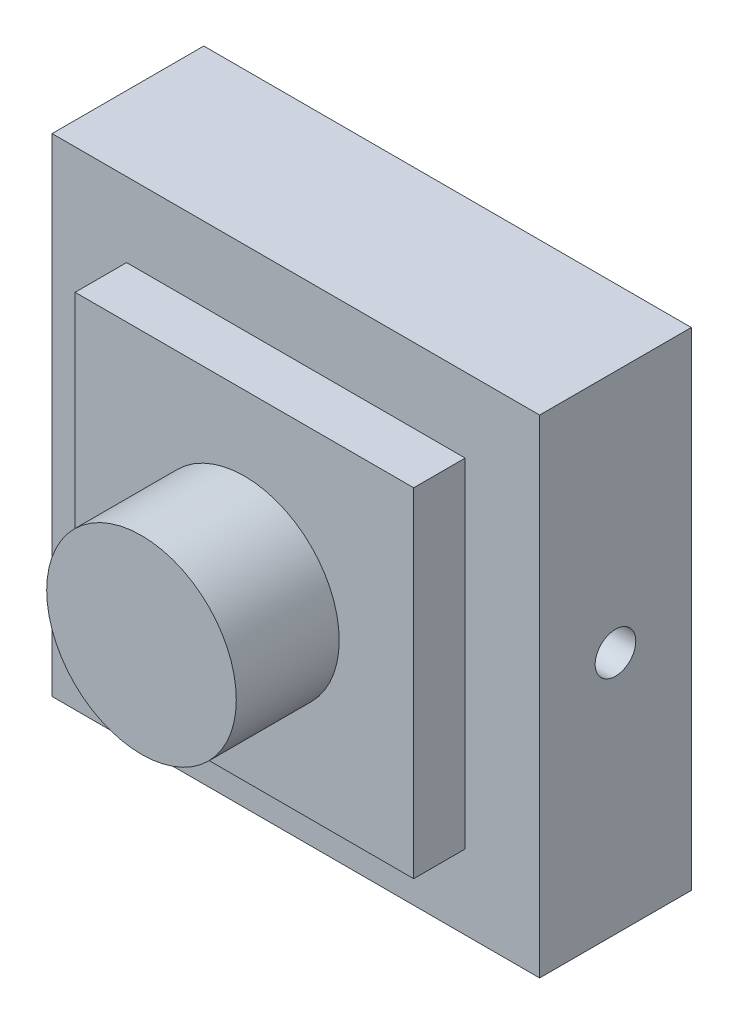
ISO-10303-21;
HEADER;
FILE_DESCRIPTION(('STEP AP214'),'2;1');
FILE_NAME('part.step','',(''),(''),'','','');
FILE_SCHEMA(('AUTOMOTIVE_DESIGN { 1 0 10303 214 1 1 1 1 }'));
ENDSEC;
DATA;
#1=APPLICATION_CONTEXT('core data for automotive mechanical design processes');
#2=APPLICATION_PROTOCOL_DEFINITION('international standard','automotive_design',2000,#1);
#3=PRODUCT_CONTEXT('',#1,'mechanical');
#4=PRODUCT('Part','Part','',(#3));
#5=PRODUCT_RELATED_PRODUCT_CATEGORY('part','',(#4));
#6=PRODUCT_DEFINITION_FORMATION('','',#4);
#7=PRODUCT_DEFINITION_CONTEXT('part definition',#1,'design');
#8=PRODUCT_DEFINITION('design','',#6,#7);
#9=PRODUCT_DEFINITION_SHAPE('','',#8);
#10=(LENGTH_UNIT() NAMED_UNIT(*) SI_UNIT(.MILLI.,.METRE.));
#11=(NAMED_UNIT(*) PLANE_ANGLE_UNIT() SI_UNIT($,.RADIAN.));
#12=(NAMED_UNIT(*) SI_UNIT($,.STERADIAN.) SOLID_ANGLE_UNIT());
#13=UNCERTAINTY_MEASURE_WITH_UNIT(LENGTH_MEASURE(1.E-05),#10,'distance_accuracy_value','');
#14=(GEOMETRIC_REPRESENTATION_CONTEXT(3) GLOBAL_UNCERTAINTY_ASSIGNED_CONTEXT((#13)) GLOBAL_UNIT_ASSIGNED_CONTEXT((#10,
#11,#12)) REPRESENTATION_CONTEXT('',''));
#15=CARTESIAN_POINT('',(0.,0.,0.));
#16=DIRECTION('',(0.,0.,1.));
#17=DIRECTION('',(1.,0.,0.));
#18=AXIS2_PLACEMENT_3D('',#15,#16,#17);
#19=CARTESIAN_POINT('',(0.,0.,11.2));
#20=DIRECTION('',(0.,0.,1.));
#21=DIRECTION('',(1.,0.,0.));
#22=AXIS2_PLACEMENT_3D('',#19,#20,#21);
#23=PLANE('',#22);
#24=DIRECTION('',(0.,-1.,0.));
#25=VECTOR('',#24,1.);
#26=CARTESIAN_POINT('',(-18.,-18.,11.2));
#27=LINE('',#26,#25);
#28=CARTESIAN_POINT('',(-18.,18.,11.2));
#29=VERTEX_POINT('',#28);
#30=CARTESIAN_POINT('',(-18.,-18.,11.2));
#31=VERTEX_POINT('',#30);
#32=EDGE_CURVE('E178',#29,#31,#27,.T.);
#33=ORIENTED_EDGE('',*,*,#32,.T.);
#34=DIRECTION('',(1.,0.,0.));
#35=VECTOR('',#34,1.);
#36=CARTESIAN_POINT('',(18.,-18.,11.2));
#37=LINE('',#36,#35);
#38=CARTESIAN_POINT('',(18.,-18.,11.2));
#39=VERTEX_POINT('',#38);
#40=EDGE_CURVE('E88',#31,#39,#37,.T.);
#41=ORIENTED_EDGE('',*,*,#40,.T.);
#42=DIRECTION('',(0.,1.,0.));
#43=VECTOR('',#42,1.);
#44=CARTESIAN_POINT('',(18.,-18.,11.2));
#45=LINE('',#44,#43);
#46=CARTESIAN_POINT('',(18.,18.,11.2));
#47=VERTEX_POINT('',#46);
#48=EDGE_CURVE('E181',#39,#47,#45,.T.);
#49=ORIENTED_EDGE('',*,*,#48,.T.);
#50=DIRECTION('',(-1.,0.,0.));
#51=VECTOR('',#50,1.);
#52=CARTESIAN_POINT('',(18.,18.,11.2));
#53=LINE('',#52,#51);
#54=EDGE_CURVE('E60',#47,#29,#53,.T.);
#55=ORIENTED_EDGE('',*,*,#54,.T.);
#56=EDGE_LOOP('',(#33,#41,#49,#55));
#57=FACE_BOUND('',#56,.T.);
#58=DIRECTION('',(1.,0.,0.));
#59=VECTOR('',#58,1.);
#60=CARTESIAN_POINT('',(12.5,-12.5,11.2));
#61=LINE('',#60,#59);
#62=CARTESIAN_POINT('',(-12.5,-12.5,11.2));
#63=VERTEX_POINT('',#62);
#64=CARTESIAN_POINT('',(12.5,-12.5,11.2));
#65=VERTEX_POINT('',#64);
#66=EDGE_CURVE('E164',#63,#65,#61,.T.);
#67=ORIENTED_EDGE('',*,*,#66,.F.);
#68=DIRECTION('',(0.,-1.,0.));
#69=VECTOR('',#68,1.);
#70=CARTESIAN_POINT('',(-12.5,-12.5,11.2));
#71=LINE('',#70,#69);
#72=CARTESIAN_POINT('',(-12.5,12.5,11.2));
#73=VERTEX_POINT('',#72);
#74=EDGE_CURVE('E148',#73,#63,#71,.T.);
#75=ORIENTED_EDGE('',*,*,#74,.F.);
#76=DIRECTION('',(-1.,0.,0.));
#77=VECTOR('',#76,1.);
#78=CARTESIAN_POINT('',(12.5,12.5,11.2));
#79=LINE('',#78,#77);
#80=CARTESIAN_POINT('',(12.5,12.5,11.2));
#81=VERTEX_POINT('',#80);
#82=EDGE_CURVE('E155',#81,#73,#79,.T.);
#83=ORIENTED_EDGE('',*,*,#82,.F.);
#84=DIRECTION('',(0.,1.,0.));
#85=VECTOR('',#84,1.);
#86=CARTESIAN_POINT('',(12.5,-12.5,11.2));
#87=LINE('',#86,#85);
#88=EDGE_CURVE('E166',#65,#81,#87,.T.);
#89=ORIENTED_EDGE('',*,*,#88,.F.);
#90=EDGE_LOOP('',(#67,#75,#83,#89));
#91=FACE_BOUND('',#90,.T.);
#92=ADVANCED_FACE('F36',(#57,#91),#23,.T.);
#93=CARTESIAN_POINT('',(-18.,-18.,11.2));
#94=DIRECTION('',(1.,0.,0.));
#95=DIRECTION('',(0.,0.,-1.));
#96=AXIS2_PLACEMENT_3D('',#93,#94,#95);
#97=PLANE('',#96);
#98=CARTESIAN_POINT('',(-18.,0.,5.6));
#99=DIRECTION('',(-1.,0.,0.));
#100=DIRECTION('',(0.,0.,1.));
#101=AXIS2_PLACEMENT_3D('',#98,#99,#100);
#102=CIRCLE('',#101,1.49999999999999);
#103=CARTESIAN_POINT('',(-18.,0.,7.09999999999999));
#104=VERTEX_POINT('',#103);
#105=EDGE_CURVE('E125',#104,#104,#102,.T.);
#106=ORIENTED_EDGE('',*,*,#105,.F.);
#107=EDGE_LOOP('',(#106));
#108=FACE_BOUND('',#107,.T.);
#109=DIRECTION('',(0.,-1.,0.));
#110=VECTOR('',#109,1.);
#111=CARTESIAN_POINT('',(-18.,-18.,0.));
#112=LINE('',#111,#110);
#113=CARTESIAN_POINT('',(-18.,18.,0.));
#114=VERTEX_POINT('',#113);
#115=CARTESIAN_POINT('',(-18.,-18.,0.));
#116=VERTEX_POINT('',#115);
#117=EDGE_CURVE('E177',#114,#116,#112,.T.);
#118=ORIENTED_EDGE('',*,*,#117,.T.);
#119=DIRECTION('',(0.,0.,-1.));
#120=VECTOR('',#119,1.);
#121=CARTESIAN_POINT('',(-18.,-18.,11.2));
#122=LINE('',#121,#120);
#123=EDGE_CURVE('E11',#31,#116,#122,.T.);
#124=ORIENTED_EDGE('',*,*,#123,.F.);
#125=ORIENTED_EDGE('',*,*,#32,.F.);
#126=DIRECTION('',(0.,0.,-1.));
#127=VECTOR('',#126,1.);
#128=CARTESIAN_POINT('',(-18.,18.,11.2));
#129=LINE('',#128,#127);
#130=EDGE_CURVE('E184',#29,#114,#129,.T.);
#131=ORIENTED_EDGE('',*,*,#130,.T.);
#132=EDGE_LOOP('',(#118,#124,#125,#131));
#133=FACE_BOUND('',#132,.T.);
#134=ADVANCED_FACE('F38',(#108,#133),#97,.F.);
#135=CARTESIAN_POINT('',(18.,-18.,11.2));
#136=DIRECTION('',(0.,1.,0.));
#137=DIRECTION('',(-1.,0.,0.));
#138=AXIS2_PLACEMENT_3D('',#135,#136,#137);
#139=PLANE('',#138);
#140=DIRECTION('',(1.,0.,0.));
#141=VECTOR('',#140,1.);
#142=CARTESIAN_POINT('',(18.,-18.,0.));
#143=LINE('',#142,#141);
#144=CARTESIAN_POINT('',(18.,-18.,0.));
#145=VERTEX_POINT('',#144);
#146=EDGE_CURVE('E187',#116,#145,#143,.T.);
#147=ORIENTED_EDGE('',*,*,#146,.T.);
#148=DIRECTION('',(0.,0.,-1.));
#149=VECTOR('',#148,1.);
#150=CARTESIAN_POINT('',(18.,-18.,11.2));
#151=LINE('',#150,#149);
#152=EDGE_CURVE('E44',#39,#145,#151,.T.);
#153=ORIENTED_EDGE('',*,*,#152,.F.);
#154=ORIENTED_EDGE('',*,*,#40,.F.);
#155=ORIENTED_EDGE('',*,*,#123,.T.);
#156=EDGE_LOOP('',(#147,#153,#154,#155));
#157=FACE_BOUND('',#156,.T.);
#158=ADVANCED_FACE('F215',(#157),#139,.F.);
#159=CARTESIAN_POINT('',(18.,-18.,11.2));
#160=DIRECTION('',(-1.,0.,0.));
#161=DIRECTION('',(0.,0.,1.));
#162=AXIS2_PLACEMENT_3D('',#159,#160,#161);
#163=PLANE('',#162);
#164=CARTESIAN_POINT('',(18.,0.,5.6));
#165=DIRECTION('',(1.,0.,0.));
#166=DIRECTION('',(0.,0.,-1.));
#167=AXIS2_PLACEMENT_3D('',#164,#165,#166);
#168=CIRCLE('',#167,1.49999999999999);
#169=CARTESIAN_POINT('',(18.,0.,4.10000000000001));
#170=VERTEX_POINT('',#169);
#171=EDGE_CURVE('E283',#170,#170,#168,.T.);
#172=ORIENTED_EDGE('',*,*,#171,.F.);
#173=EDGE_LOOP('',(#172));
#174=FACE_BOUND('',#173,.T.);
#175=DIRECTION('',(0.,1.,0.));
#176=VECTOR('',#175,1.);
#177=CARTESIAN_POINT('',(18.,-18.,0.));
#178=LINE('',#177,#176);
#179=CARTESIAN_POINT('',(18.,18.,0.));
#180=VERTEX_POINT('',#179);
#181=EDGE_CURVE('E189',#145,#180,#178,.T.);
#182=ORIENTED_EDGE('',*,*,#181,.T.);
#183=DIRECTION('',(0.,0.,-1.));
#184=VECTOR('',#183,1.);
#185=CARTESIAN_POINT('',(18.,18.,11.2));
#186=LINE('',#185,#184);
#187=EDGE_CURVE('E193',#47,#180,#186,.T.);
#188=ORIENTED_EDGE('',*,*,#187,.F.);
#189=ORIENTED_EDGE('',*,*,#48,.F.);
#190=ORIENTED_EDGE('',*,*,#152,.T.);
#191=EDGE_LOOP('',(#182,#188,#189,#190));
#192=FACE_BOUND('',#191,.T.);
#193=ADVANCED_FACE('F198',(#174,#192),#163,.F.);
#194=CARTESIAN_POINT('',(18.,18.,11.2));
#195=DIRECTION('',(0.,-1.,0.));
#196=DIRECTION('',(1.,0.,0.));
#197=AXIS2_PLACEMENT_3D('',#194,#195,#196);
#198=PLANE('',#197);
#199=DIRECTION('',(-1.,0.,0.));
#200=VECTOR('',#199,1.);
#201=CARTESIAN_POINT('',(18.,18.,0.));
#202=LINE('',#201,#200);
#203=EDGE_CURVE('E81',#180,#114,#202,.T.);
#204=ORIENTED_EDGE('',*,*,#203,.T.);
#205=ORIENTED_EDGE('',*,*,#130,.F.);
#206=ORIENTED_EDGE('',*,*,#54,.F.);
#207=ORIENTED_EDGE('',*,*,#187,.T.);
#208=EDGE_LOOP('',(#204,#205,#206,#207));
#209=FACE_BOUND('',#208,.T.);
#210=ADVANCED_FACE('F206',(#209),#198,.F.);
#211=CARTESIAN_POINT('',(0.,0.,0.));
#212=DIRECTION('',(0.,0.,1.));
#213=DIRECTION('',(1.,0.,0.));
#214=AXIS2_PLACEMENT_3D('',#211,#212,#213);
#215=PLANE('',#214);
#216=ORIENTED_EDGE('',*,*,#117,.F.);
#217=ORIENTED_EDGE('',*,*,#203,.F.);
#218=ORIENTED_EDGE('',*,*,#181,.F.);
#219=ORIENTED_EDGE('',*,*,#146,.F.);
#220=EDGE_LOOP('',(#216,#217,#218,#219));
#221=FACE_BOUND('',#220,.T.);
#222=ADVANCED_FACE('F202',(#221),#215,.F.);
#223=CARTESIAN_POINT('',(-12.5,-12.5,15.));
#224=DIRECTION('',(1.,0.,0.));
#225=DIRECTION('',(0.,0.,-1.));
#226=AXIS2_PLACEMENT_3D('',#223,#224,#225);
#227=PLANE('',#226);
#228=ORIENTED_EDGE('',*,*,#74,.T.);
#229=DIRECTION('',(0.,0.,-1.));
#230=VECTOR('',#229,1.);
#231=CARTESIAN_POINT('',(-12.5,-12.5,15.));
#232=LINE('',#231,#230);
#233=CARTESIAN_POINT('',(-12.5,-12.5,15.));
#234=VERTEX_POINT('',#233);
#235=EDGE_CURVE('E175',#234,#63,#232,.T.);
#236=ORIENTED_EDGE('',*,*,#235,.F.);
#237=DIRECTION('',(0.,-1.,0.));
#238=VECTOR('',#237,1.);
#239=CARTESIAN_POINT('',(-12.5,-12.5,15.));
#240=LINE('',#239,#238);
#241=CARTESIAN_POINT('',(-12.5,12.5,15.));
#242=VERTEX_POINT('',#241);
#243=EDGE_CURVE('E151',#242,#234,#240,.T.);
#244=ORIENTED_EDGE('',*,*,#243,.F.);
#245=DIRECTION('',(0.,0.,-1.));
#246=VECTOR('',#245,1.);
#247=CARTESIAN_POINT('',(-12.5,12.5,15.));
#248=LINE('',#247,#246);
#249=EDGE_CURVE('E161',#242,#73,#248,.T.);
#250=ORIENTED_EDGE('',*,*,#249,.T.);
#251=EDGE_LOOP('',(#228,#236,#244,#250));
#252=FACE_BOUND('',#251,.T.);
#253=ADVANCED_FACE('F213',(#252),#227,.F.);
#254=CARTESIAN_POINT('',(12.5,-12.5,15.));
#255=DIRECTION('',(0.,1.,0.));
#256=DIRECTION('',(-1.,0.,0.));
#257=AXIS2_PLACEMENT_3D('',#254,#255,#256);
#258=PLANE('',#257);
#259=ORIENTED_EDGE('',*,*,#66,.T.);
#260=DIRECTION('',(0.,0.,-1.));
#261=VECTOR('',#260,1.);
#262=CARTESIAN_POINT('',(12.5,-12.5,15.));
#263=LINE('',#262,#261);
#264=CARTESIAN_POINT('',(12.5,-12.5,15.));
#265=VERTEX_POINT('',#264);
#266=EDGE_CURVE('E172',#265,#65,#263,.T.);
#267=ORIENTED_EDGE('',*,*,#266,.F.);
#268=DIRECTION('',(1.,0.,0.));
#269=VECTOR('',#268,1.);
#270=CARTESIAN_POINT('',(12.5,-12.5,15.));
#271=LINE('',#270,#269);
#272=EDGE_CURVE('E154',#234,#265,#271,.T.);
#273=ORIENTED_EDGE('',*,*,#272,.F.);
#274=ORIENTED_EDGE('',*,*,#235,.T.);
#275=EDGE_LOOP('',(#259,#267,#273,#274));
#276=FACE_BOUND('',#275,.T.);
#277=ADVANCED_FACE('F228',(#276),#258,.F.);
#278=CARTESIAN_POINT('',(12.5,-12.5,15.));
#279=DIRECTION('',(-1.,0.,0.));
#280=DIRECTION('',(0.,0.,1.));
#281=AXIS2_PLACEMENT_3D('',#278,#279,#280);
#282=PLANE('',#281);
#283=ORIENTED_EDGE('',*,*,#88,.T.);
#284=DIRECTION('',(0.,0.,-1.));
#285=VECTOR('',#284,1.);
#286=CARTESIAN_POINT('',(12.5,12.5,15.));
#287=LINE('',#286,#285);
#288=CARTESIAN_POINT('',(12.5,12.5,15.));
#289=VERTEX_POINT('',#288);
#290=EDGE_CURVE('E51',#289,#81,#287,.T.);
#291=ORIENTED_EDGE('',*,*,#290,.F.);
#292=DIRECTION('',(0.,1.,0.));
#293=VECTOR('',#292,1.);
#294=CARTESIAN_POINT('',(12.5,-12.5,15.));
#295=LINE('',#294,#293);
#296=EDGE_CURVE('E157',#265,#289,#295,.T.);
#297=ORIENTED_EDGE('',*,*,#296,.F.);
#298=ORIENTED_EDGE('',*,*,#266,.T.);
#299=EDGE_LOOP('',(#283,#291,#297,#298));
#300=FACE_BOUND('',#299,.T.);
#301=ADVANCED_FACE('F232',(#300),#282,.F.);
#302=CARTESIAN_POINT('',(12.5,12.5,15.));
#303=DIRECTION('',(0.,-1.,0.));
#304=DIRECTION('',(1.,0.,0.));
#305=AXIS2_PLACEMENT_3D('',#302,#303,#304);
#306=PLANE('',#305);
#307=ORIENTED_EDGE('',*,*,#82,.T.);
#308=ORIENTED_EDGE('',*,*,#249,.F.);
#309=DIRECTION('',(-1.,0.,0.));
#310=VECTOR('',#309,1.);
#311=CARTESIAN_POINT('',(12.5,12.5,15.));
#312=LINE('',#311,#310);
#313=EDGE_CURVE('E159',#289,#242,#312,.T.);
#314=ORIENTED_EDGE('',*,*,#313,.F.);
#315=ORIENTED_EDGE('',*,*,#290,.T.);
#316=EDGE_LOOP('',(#307,#308,#314,#315));
#317=FACE_BOUND('',#316,.T.);
#318=ADVANCED_FACE('F236',(#317),#306,.F.);
#319=CARTESIAN_POINT('',(0.,0.,15.));
#320=DIRECTION('',(0.,0.,1.));
#321=DIRECTION('',(1.,0.,0.));
#322=AXIS2_PLACEMENT_3D('',#319,#320,#321);
#323=PLANE('',#322);
#324=CARTESIAN_POINT('',(0.,0.,15.));
#325=DIRECTION('',(0.,0.,1.));
#326=DIRECTION('',(1.,0.,0.));
#327=AXIS2_PLACEMENT_3D('',#324,#325,#326);
#328=CIRCLE('',#327,7.);
#329=CARTESIAN_POINT('',(-7.,0.,15.));
#330=VERTEX_POINT('',#329);
#331=EDGE_CURVE('E144',#330,#330,#328,.T.);
#332=ORIENTED_EDGE('',*,*,#331,.F.);
#333=EDGE_LOOP('',(#332));
#334=FACE_BOUND('',#333,.T.);
#335=ORIENTED_EDGE('',*,*,#243,.T.);
#336=ORIENTED_EDGE('',*,*,#272,.T.);
#337=ORIENTED_EDGE('',*,*,#296,.T.);
#338=ORIENTED_EDGE('',*,*,#313,.T.);
#339=EDGE_LOOP('',(#335,#336,#337,#338));
#340=FACE_BOUND('',#339,.T.);
#341=ADVANCED_FACE('F240',(#334,#340),#323,.T.);
#342=CARTESIAN_POINT('',(0.,0.,22.6));
#343=DIRECTION('',(0.,0.,-1.));
#344=DIRECTION('',(-1.,0.,0.));
#345=AXIS2_PLACEMENT_3D('',#342,#343,#344);
#346=CYLINDRICAL_SURFACE('',#345,7.);
#347=CARTESIAN_POINT('',(0.,0.,22.6));
#348=DIRECTION('',(0.,0.,1.));
#349=DIRECTION('',(1.,0.,0.));
#350=AXIS2_PLACEMENT_3D('',#347,#348,#349);
#351=CIRCLE('',#350,7.);
#352=CARTESIAN_POINT('',(-7.,0.,22.6));
#353=VERTEX_POINT('',#352);
#354=EDGE_CURVE('E145',#353,#353,#351,.T.);
#355=CARTESIAN_POINT('',(-7.,0.,22.6));
#356=CARTESIAN_POINT('',(-7.,0.,22.5208333333333));
#357=CARTESIAN_POINT('',(-7.,0.,22.4416666666667));
#358=CARTESIAN_POINT('',(-7.,0.,22.2833333333333));
#359=CARTESIAN_POINT('',(-7.,0.,22.2041666666667));
#360=CARTESIAN_POINT('',(-7.,0.,22.0458333333333));
#361=CARTESIAN_POINT('',(-7.,0.,21.9666666666667));
#362=CARTESIAN_POINT('',(-7.,0.,21.8083333333333));
#363=CARTESIAN_POINT('',(-7.,0.,21.7291666666667));
#364=CARTESIAN_POINT('',(-7.,0.,21.5708333333333));
#365=CARTESIAN_POINT('',(-7.,0.,21.4916666666667));
#366=CARTESIAN_POINT('',(-7.,0.,21.3333333333333));
#367=CARTESIAN_POINT('',(-7.,0.,21.2541666666667));
#368=CARTESIAN_POINT('',(-7.,0.,21.0958333333333));
#369=CARTESIAN_POINT('',(-7.,0.,21.0166666666667));
#370=CARTESIAN_POINT('',(-7.,0.,20.8583333333333));
#371=CARTESIAN_POINT('',(-7.,0.,20.7791666666667));
#372=CARTESIAN_POINT('',(-7.,0.,20.6208333333333));
#373=CARTESIAN_POINT('',(-7.,0.,20.5416666666667));
#374=CARTESIAN_POINT('',(-7.,0.,20.3833333333333));
#375=CARTESIAN_POINT('',(-7.,0.,20.3041666666667));
#376=CARTESIAN_POINT('',(-7.,0.,20.1458333333333));
#377=CARTESIAN_POINT('',(-7.,0.,20.0666666666667));
#378=CARTESIAN_POINT('',(-7.,0.,19.9083333333333));
#379=CARTESIAN_POINT('',(-7.,0.,19.8291666666667));
#380=CARTESIAN_POINT('',(-7.,0.,19.6708333333333));
#381=CARTESIAN_POINT('',(-7.,0.,19.5916666666667));
#382=CARTESIAN_POINT('',(-7.,0.,19.4333333333333));
#383=CARTESIAN_POINT('',(-7.,0.,19.3541666666667));
#384=CARTESIAN_POINT('',(-7.,0.,19.1958333333333));
#385=CARTESIAN_POINT('',(-7.,0.,19.1166666666667));
#386=CARTESIAN_POINT('',(-7.,0.,18.9583333333333));
#387=CARTESIAN_POINT('',(-7.,0.,18.8791666666667));
#388=CARTESIAN_POINT('',(-7.,0.,18.7208333333333));
#389=CARTESIAN_POINT('',(-7.,0.,18.6416666666667));
#390=CARTESIAN_POINT('',(-7.,0.,18.4833333333333));
#391=CARTESIAN_POINT('',(-7.,0.,18.4041666666667));
#392=CARTESIAN_POINT('',(-7.,0.,18.2458333333333));
#393=CARTESIAN_POINT('',(-7.,0.,18.1666666666667));
#394=CARTESIAN_POINT('',(-7.,0.,18.0083333333333));
#395=CARTESIAN_POINT('',(-7.,0.,17.9291666666667));
#396=CARTESIAN_POINT('',(-7.,0.,17.7708333333333));
#397=CARTESIAN_POINT('',(-7.,0.,17.6916666666667));
#398=CARTESIAN_POINT('',(-7.,0.,17.5333333333333));
#399=CARTESIAN_POINT('',(-7.,0.,17.4541666666667));
#400=CARTESIAN_POINT('',(-7.,0.,17.2958333333333));
#401=CARTESIAN_POINT('',(-7.,0.,17.2166666666667));
#402=CARTESIAN_POINT('',(-7.,0.,17.0583333333333));
#403=CARTESIAN_POINT('',(-7.,0.,16.9791666666667));
#404=CARTESIAN_POINT('',(-7.,0.,16.8208333333333));
#405=CARTESIAN_POINT('',(-7.,0.,16.7416666666667));
#406=CARTESIAN_POINT('',(-7.,0.,16.5833333333333));
#407=CARTESIAN_POINT('',(-7.,0.,16.5041666666667));
#408=CARTESIAN_POINT('',(-7.,0.,16.3458333333333));
#409=CARTESIAN_POINT('',(-7.,0.,16.2666666666667));
#410=CARTESIAN_POINT('',(-7.,0.,16.1083333333333));
#411=CARTESIAN_POINT('',(-7.,0.,16.0291666666667));
#412=CARTESIAN_POINT('',(-7.,0.,15.8708333333333));
#413=CARTESIAN_POINT('',(-7.,0.,15.7916666666667));
#414=CARTESIAN_POINT('',(-7.,0.,15.6333333333333));
#415=CARTESIAN_POINT('',(-7.,0.,15.5541666666667));
#416=CARTESIAN_POINT('',(-7.,0.,15.3958333333333));
#417=CARTESIAN_POINT('',(-7.,0.,15.3166666666667));
#418=CARTESIAN_POINT('',(-7.,0.,15.1583333333333));
#419=CARTESIAN_POINT('',(-7.,0.,15.0791666666667));
#420=CARTESIAN_POINT('',(-7.,0.,15.));
#421=B_SPLINE_CURVE_WITH_KNOTS('',3,(#355,#356,#357,#358,#359,#360,#361,#362,#363,#364,#365,
#366,#367,#368,#369,#370,#371,#372,#373,#374,#375,#376,#377,#378,#379,#380,#381,#382,#383,#384,
#385,#386,#387,#388,#389,#390,#391,#392,#393,#394,#395,#396,#397,#398,#399,#400,#401,#402,#403,
#404,#405,#406,#407,#408,#409,#410,#411,#412,#413,#414,#415,#416,#417,#418,#419,#420),
.UNSPECIFIED.,.F.,.F.,(4,2,2,2,2,2,2,2,2,2,2,2,2,2,2,2,2,2,2,2,2,2,2,2,2,2,2,2,2,2,2,2,4),(0.,
0.237500000000002,0.475000000000003,0.712500000000001,0.950000000000003,1.1875,1.425,1.6625,1.9,
2.1375,2.375,2.6125,2.85,3.0875,3.325,3.5625,3.8,4.0375,4.275,4.5125,4.75,4.9875,5.225,5.4625,
5.7,5.9375,6.175,6.4125,6.65,6.8875,7.125,7.3625,7.6),.UNSPECIFIED.);
#422=EDGE_CURVE('BSEAM243',#353,#330,#421,.T.);
#423=ORIENTED_EDGE('',*,*,#354,.F.);
#424=ORIENTED_EDGE('',*,*,#331,.T.);
#425=ORIENTED_EDGE('',*,*,#422,.T.);
#426=ORIENTED_EDGE('',*,*,#422,.F.);
#427=EDGE_LOOP('',(#423,#425,#424,#426));
#428=FACE_BOUND('',#427,.T.);
#429=ADVANCED_FACE('F243',(#428),#346,.T.);
#430=CARTESIAN_POINT('',(0.,0.,22.6));
#431=DIRECTION('',(0.,0.,1.));
#432=DIRECTION('',(1.,0.,0.));
#433=AXIS2_PLACEMENT_3D('',#430,#431,#432);
#434=PLANE('',#433);
#435=ORIENTED_EDGE('',*,*,#354,.T.);
#436=EDGE_LOOP('',(#435));
#437=FACE_BOUND('',#436,.T.);
#438=ADVANCED_FACE('F247',(#437),#434,.T.);
#439=CARTESIAN_POINT('',(-10.5,0.,5.6));
#440=DIRECTION('',(-1.,0.,0.));
#441=DIRECTION('',(0.,0.,1.));
#442=AXIS2_PLACEMENT_3D('',#439,#440,#441);
#443=CONICAL_SURFACE('',#442,1.25,1.02974425867665);
#444=CARTESIAN_POINT('',(-9.74892422621555,0.,5.6));
#445=VERTEX_POINT('',#444);
#446=VERTEX_LOOP('',#445);
#447=FACE_BOUND('',#446,.T.);
#448=CARTESIAN_POINT('',(-10.5,0.,5.6));
#449=DIRECTION('',(-1.,0.,0.));
#450=DIRECTION('',(0.,0.,1.));
#451=AXIS2_PLACEMENT_3D('',#448,#449,#450);
#452=CIRCLE('',#451,1.25);
#453=CARTESIAN_POINT('',(-10.5,0.,6.85));
#454=VERTEX_POINT('',#453);
#455=EDGE_CURVE('E141',#454,#454,#452,.T.);
#456=ORIENTED_EDGE('',*,*,#455,.T.);
#457=EDGE_LOOP('',(#456));
#458=FACE_BOUND('',#457,.T.);
#459=ADVANCED_FACE('F251',(#447,#458),#443,.F.);
#460=CARTESIAN_POINT('',(-18.,0.,5.6));
#461=DIRECTION('',(-1.,0.,0.));
#462=DIRECTION('',(0.,0.,1.));
#463=AXIS2_PLACEMENT_3D('',#460,#461,#462);
#464=CYLINDRICAL_SURFACE('',#463,1.25);
#465=ORIENTED_EDGE('',*,*,#455,.F.);
#466=EDGE_LOOP('',(#465));
#467=FACE_BOUND('',#466,.T.);
#468=CARTESIAN_POINT('',(-12.,0.,5.6));
#469=DIRECTION('',(-1.,0.,0.));
#470=DIRECTION('',(0.,0.,1.));
#471=AXIS2_PLACEMENT_3D('',#468,#469,#470);
#472=CIRCLE('',#471,1.25);
#473=CARTESIAN_POINT('',(-12.,0.,6.85));
#474=VERTEX_POINT('',#473);
#475=EDGE_CURVE('E138',#474,#474,#472,.T.);
#476=ORIENTED_EDGE('',*,*,#475,.T.);
#477=EDGE_LOOP('',(#476));
#478=FACE_BOUND('',#477,.T.);
#479=ADVANCED_FACE('F255',(#467,#478),#464,.F.);
#480=CARTESIAN_POINT('',(-12.,1.25,5.6));
#481=DIRECTION('',(1.,0.,0.));
#482=DIRECTION('',(0.,0.,-1.));
#483=AXIS2_PLACEMENT_3D('',#480,#481,#482);
#484=PLANE('',#483);
#485=ORIENTED_EDGE('',*,*,#475,.F.);
#486=EDGE_LOOP('',(#485));
#487=FACE_BOUND('',#486,.T.);
#488=CARTESIAN_POINT('',(-12.,0.,5.6));
#489=DIRECTION('',(-1.,0.,0.));
#490=DIRECTION('',(0.,0.,1.));
#491=AXIS2_PLACEMENT_3D('',#488,#489,#490);
#492=CIRCLE('',#491,1.5);
#493=CARTESIAN_POINT('',(-12.,0.,7.1));
#494=VERTEX_POINT('',#493);
#495=EDGE_CURVE('E129',#494,#494,#492,.T.);
#496=ORIENTED_EDGE('',*,*,#495,.T.);
#497=EDGE_LOOP('',(#496));
#498=FACE_BOUND('',#497,.T.);
#499=ADVANCED_FACE('F259',(#487,#498),#484,.F.);
#500=CARTESIAN_POINT('',(-18.,0.,5.6));
#501=DIRECTION('',(-1.,0.,0.));
#502=DIRECTION('',(0.,0.,1.));
#503=AXIS2_PLACEMENT_3D('',#500,#501,#502);
#504=CYLINDRICAL_SURFACE('',#503,1.49999999999999);
#505=ORIENTED_EDGE('',*,*,#495,.F.);
#506=EDGE_LOOP('',(#505));
#507=FACE_BOUND('',#506,.T.);
#508=ORIENTED_EDGE('',*,*,#105,.T.);
#509=EDGE_LOOP('',(#508));
#510=FACE_BOUND('',#509,.T.);
#511=ADVANCED_FACE('F119',(#507,#510),#504,.F.);
#512=CARTESIAN_POINT('',(10.5,0.,5.6));
#513=DIRECTION('',(1.,0.,0.));
#514=DIRECTION('',(0.,0.,-1.));
#515=AXIS2_PLACEMENT_3D('',#512,#513,#514);
#516=CONICAL_SURFACE('',#515,1.25,1.02974425867665);
#517=CARTESIAN_POINT('',(9.74892422621555,0.,5.6));
#518=VERTEX_POINT('',#517);
#519=VERTEX_LOOP('',#518);
#520=FACE_BOUND('',#519,.T.);
#521=CARTESIAN_POINT('',(10.5,0.,5.6));
#522=DIRECTION('',(1.,0.,0.));
#523=DIRECTION('',(0.,0.,-1.));
#524=AXIS2_PLACEMENT_3D('',#521,#522,#523);
#525=CIRCLE('',#524,1.25);
#526=CARTESIAN_POINT('',(10.5,0.,4.35));
#527=VERTEX_POINT('',#526);
#528=EDGE_CURVE('E123',#527,#527,#525,.T.);
#529=ORIENTED_EDGE('',*,*,#528,.T.);
#530=EDGE_LOOP('',(#529));
#531=FACE_BOUND('',#530,.T.);
#532=ADVANCED_FACE('F115',(#520,#531),#516,.F.);
#533=CARTESIAN_POINT('',(18.,0.,5.6));
#534=DIRECTION('',(1.,0.,0.));
#535=DIRECTION('',(0.,0.,-1.));
#536=AXIS2_PLACEMENT_3D('',#533,#534,#535);
#537=CYLINDRICAL_SURFACE('',#536,1.25);
#538=ORIENTED_EDGE('',*,*,#528,.F.);
#539=EDGE_LOOP('',(#538));
#540=FACE_BOUND('',#539,.T.);
#541=CARTESIAN_POINT('',(12.,0.,5.6));
#542=DIRECTION('',(1.,0.,0.));
#543=DIRECTION('',(0.,0.,-1.));
#544=AXIS2_PLACEMENT_3D('',#541,#542,#543);
#545=CIRCLE('',#544,1.25);
#546=CARTESIAN_POINT('',(12.,0.,4.35));
#547=VERTEX_POINT('',#546);
#548=EDGE_CURVE('E126',#547,#547,#545,.T.);
#549=ORIENTED_EDGE('',*,*,#548,.T.);
#550=EDGE_LOOP('',(#549));
#551=FACE_BOUND('',#550,.T.);
#552=ADVANCED_FACE('F118',(#540,#551),#537,.F.);
#553=CARTESIAN_POINT('',(12.,1.25,5.6));
#554=DIRECTION('',(-1.,0.,0.));
#555=DIRECTION('',(0.,0.,1.));
#556=AXIS2_PLACEMENT_3D('',#553,#554,#555);
#557=PLANE('',#556);
#558=ORIENTED_EDGE('',*,*,#548,.F.);
#559=EDGE_LOOP('',(#558));
#560=FACE_BOUND('',#559,.T.);
#561=CARTESIAN_POINT('',(12.,0.,5.6));
#562=DIRECTION('',(1.,0.,0.));
#563=DIRECTION('',(0.,0.,-1.));
#564=AXIS2_PLACEMENT_3D('',#561,#562,#563);
#565=CIRCLE('',#564,1.5);
#566=CARTESIAN_POINT('',(12.,0.,4.1));
#567=VERTEX_POINT('',#566);
#568=EDGE_CURVE('E132',#567,#567,#565,.T.);
#569=ORIENTED_EDGE('',*,*,#568,.T.);
#570=EDGE_LOOP('',(#569));
#571=FACE_BOUND('',#570,.T.);
#572=ADVANCED_FACE('F269',(#560,#571),#557,.F.);
#573=CARTESIAN_POINT('',(18.,0.,5.6));
#574=DIRECTION('',(1.,0.,0.));
#575=DIRECTION('',(0.,0.,-1.));
#576=AXIS2_PLACEMENT_3D('',#573,#574,#575);
#577=CYLINDRICAL_SURFACE('',#576,1.49999999999999);
#578=ORIENTED_EDGE('',*,*,#568,.F.);
#579=EDGE_LOOP('',(#578));
#580=FACE_BOUND('',#579,.T.);
#581=ORIENTED_EDGE('',*,*,#171,.T.);
#582=EDGE_LOOP('',(#581));
#583=FACE_BOUND('',#582,.T.);
#584=ADVANCED_FACE('F272',(#580,#583),#577,.F.);
#585=CLOSED_SHELL('',(#92,#134,#158,#193,#210,#222,#253,#277,#301,#318,#341,#429,#438,#459,#479,
#499,#511,#532,#552,#572,#584));
#586=MANIFOLD_SOLID_BREP('B2',#585);
#587=ADVANCED_BREP_SHAPE_REPRESENTATION('',(#18,#586),#14);
#588=SHAPE_DEFINITION_REPRESENTATION(#9,#587);
ENDSEC;
END-ISO-10303-21;
